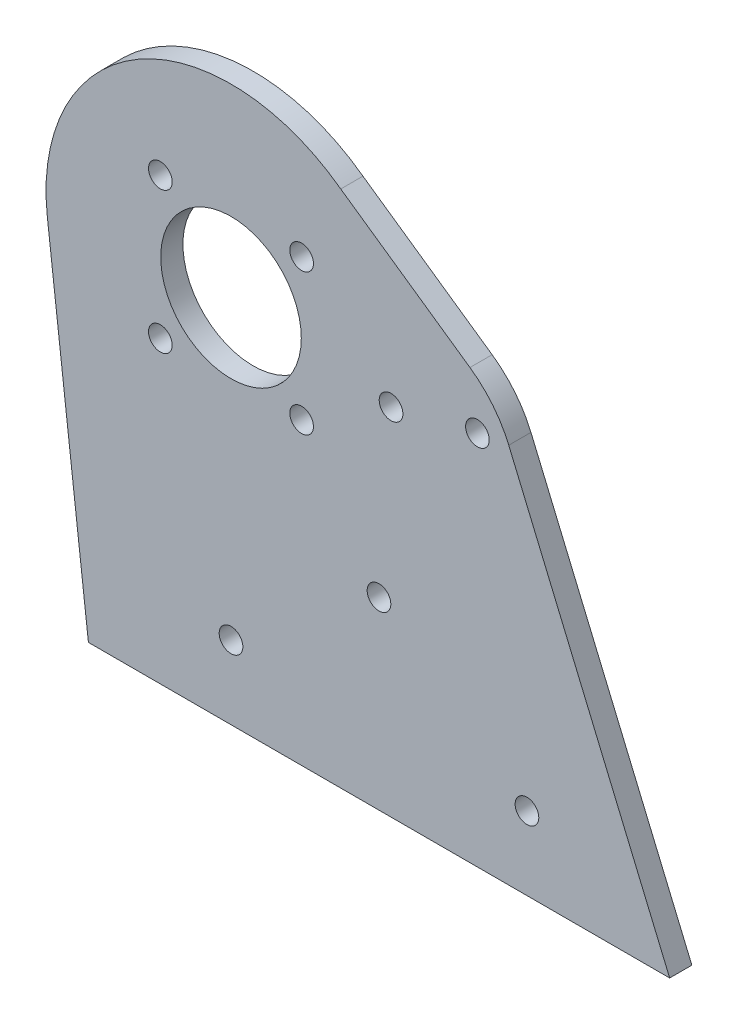
ISO-10303-21;
HEADER;
FILE_DESCRIPTION(('STEP AP214'),'2;1');
FILE_NAME('part.step','',(''),(''),'','','');
FILE_SCHEMA(('AUTOMOTIVE_DESIGN { 1 0 10303 214 1 1 1 1 }'));
ENDSEC;
DATA;
#1=APPLICATION_CONTEXT('core data for automotive mechanical design processes');
#2=APPLICATION_PROTOCOL_DEFINITION('international standard','automotive_design',2000,#1);
#3=PRODUCT_CONTEXT('',#1,'mechanical');
#4=PRODUCT('Part','Part','',(#3));
#5=PRODUCT_RELATED_PRODUCT_CATEGORY('part','',(#4));
#6=PRODUCT_DEFINITION_FORMATION('','',#4);
#7=PRODUCT_DEFINITION_CONTEXT('part definition',#1,'design');
#8=PRODUCT_DEFINITION('design','',#6,#7);
#9=PRODUCT_DEFINITION_SHAPE('','',#8);
#10=(LENGTH_UNIT() NAMED_UNIT(*) SI_UNIT(.MILLI.,.METRE.));
#11=(NAMED_UNIT(*) PLANE_ANGLE_UNIT() SI_UNIT($,.RADIAN.));
#12=(NAMED_UNIT(*) SI_UNIT($,.STERADIAN.) SOLID_ANGLE_UNIT());
#13=UNCERTAINTY_MEASURE_WITH_UNIT(LENGTH_MEASURE(1.E-05),#10,'distance_accuracy_value','');
#14=(GEOMETRIC_REPRESENTATION_CONTEXT(3) GLOBAL_UNCERTAINTY_ASSIGNED_CONTEXT((#13)) GLOBAL_UNIT_ASSIGNED_CONTEXT((#10,
#11,#12)) REPRESENTATION_CONTEXT('',''));
#15=CARTESIAN_POINT('',(0.,0.,0.));
#16=DIRECTION('',(0.,0.,1.));
#17=DIRECTION('',(1.,0.,0.));
#18=AXIS2_PLACEMENT_3D('',#15,#16,#17);
#19=CARTESIAN_POINT('',(28.2496560925512,11.9322590620429,3.));
#20=DIRECTION('',(0.921195491285499,0.389100073034263,0.));
#21=DIRECTION('',(-0.389100073034263,0.921195491285499,0.));
#22=AXIS2_PLACEMENT_3D('',#19,#20,#21);
#23=PLANE('',#22);
#24=DIRECTION('',(0.389100073034263,-0.921195491285499,0.));
#25=VECTOR('',#24,1.);
#26=CARTESIAN_POINT('',(28.2496560925512,11.9322590620429,0.));
#27=LINE('',#26,#25);
#28=CARTESIAN_POINT('',(27.9968136972938,12.5308641270602,0.));
#29=VERTEX_POINT('',#28);
#30=CARTESIAN_POINT('',(49.7449466353483,-38.9579003190192,0.));
#31=VERTEX_POINT('',#30);
#32=EDGE_CURVE('E133',#29,#31,#27,.T.);
#33=ORIENTED_EDGE('',*,*,#32,.F.);
#34=DIRECTION('',(0.,0.,-1.));
#35=VECTOR('',#34,1.);
#36=CARTESIAN_POINT('',(27.9968136972938,12.5308641270602,3.));
#37=LINE('',#36,#35);
#38=CARTESIAN_POINT('',(27.9968136972938,12.5308641270602,3.));
#39=VERTEX_POINT('',#38);
#40=EDGE_CURVE('E11',#39,#29,#37,.T.);
#41=ORIENTED_EDGE('',*,*,#40,.F.);
#42=DIRECTION('',(0.389100073034263,-0.921195491285499,0.));
#43=VECTOR('',#42,1.);
#44=CARTESIAN_POINT('',(28.2496560925512,11.9322590620429,3.));
#45=LINE('',#44,#43);
#46=CARTESIAN_POINT('',(49.7449466353483,-38.9579003190192,3.));
#47=VERTEX_POINT('',#46);
#48=EDGE_CURVE('E247',#39,#47,#45,.T.);
#49=ORIENTED_EDGE('',*,*,#48,.T.);
#50=DIRECTION('',(0.,0.,-1.));
#51=VECTOR('',#50,1.);
#52=CARTESIAN_POINT('',(49.7449466353483,-38.9579003190192,3.));
#53=LINE('',#52,#51);
#54=EDGE_CURVE('E82',#47,#31,#53,.T.);
#55=ORIENTED_EDGE('',*,*,#54,.T.);
#56=EDGE_LOOP('',(#33,#41,#49,#55));
#57=FACE_BOUND('',#56,.T.);
#58=ADVANCED_FACE('F36',(#57),#23,.T.);
#59=CARTESIAN_POINT('',(14.1788813280114,6.69436303154627,3.));
#60=DIRECTION('',(0.,0.,-1.));
#61=DIRECTION('',(-1.,0.,0.));
#62=AXIS2_PLACEMENT_3D('',#59,#60,#61);
#63=CYLINDRICAL_SURFACE('',#62,14.9999999999999);
#64=CARTESIAN_POINT('',(14.1788813280114,6.69436303154627,0.));
#65=DIRECTION('',(0.,0.,1.));
#66=DIRECTION('',(1.,0.,0.));
#67=AXIS2_PLACEMENT_3D('',#64,#65,#66);
#68=CIRCLE('',#67,14.9999999999999);
#69=CARTESIAN_POINT('',(22.7526786089361,19.0024904352419,0.));
#70=VERTEX_POINT('',#69);
#71=EDGE_CURVE('E131',#29,#70,#68,.T.);
#72=ORIENTED_EDGE('',*,*,#71,.T.);
#73=DIRECTION('',(0.,0.,-1.));
#74=VECTOR('',#73,1.);
#75=CARTESIAN_POINT('',(22.7526786089361,19.0024904352419,3.));
#76=LINE('',#75,#74);
#77=CARTESIAN_POINT('',(22.7526786089361,19.0024904352419,3.));
#78=VERTEX_POINT('',#77);
#79=EDGE_CURVE('E46',#78,#70,#76,.T.);
#80=ORIENTED_EDGE('',*,*,#79,.F.);
#81=CARTESIAN_POINT('',(14.1788813280114,6.69436303154627,3.));
#82=DIRECTION('',(0.,0.,1.));
#83=DIRECTION('',(1.,0.,0.));
#84=AXIS2_PLACEMENT_3D('',#81,#82,#83);
#85=CIRCLE('',#84,14.9999999999999);
#86=EDGE_CURVE('E249',#39,#78,#85,.T.);
#87=ORIENTED_EDGE('',*,*,#86,.F.);
#88=ORIENTED_EDGE('',*,*,#40,.T.);
#89=EDGE_LOOP('',(#72,#80,#87,#88));
#90=FACE_BOUND('',#89,.T.);
#91=ADVANCED_FACE('F132',(#90),#63,.T.);
#92=CARTESIAN_POINT('',(16.3459226912162,23.4654135644258,3.));
#93=DIRECTION('',(-0.571586485394987,-0.820541826913051,0.));
#94=DIRECTION('',(0.820541826913051,-0.571586485394987,0.));
#95=AXIS2_PLACEMENT_3D('',#92,#93,#94);
#96=PLANE('',#95);
#97=DIRECTION('',(-0.820541826913051,0.571586485394987,0.));
#98=VECTOR('',#97,1.);
#99=CARTESIAN_POINT('',(16.3459226912162,23.4654135644258,0.));
#100=LINE('',#99,#98);
#101=CARTESIAN_POINT('',(5.29002578608377,31.1669115839333,0.));
#102=VERTEX_POINT('',#101);
#103=EDGE_CURVE('E128',#70,#102,#100,.T.);
#104=ORIENTED_EDGE('',*,*,#103,.T.);
#105=DIRECTION('',(0.,0.,-1.));
#106=VECTOR('',#105,1.);
#107=CARTESIAN_POINT('',(5.29002578608377,31.1669115839333,3.));
#108=LINE('',#107,#106);
#109=CARTESIAN_POINT('',(5.29002578608377,31.1669115839333,3.));
#110=VERTEX_POINT('',#109);
#111=EDGE_CURVE('E116',#110,#102,#108,.T.);
#112=ORIENTED_EDGE('',*,*,#111,.F.);
#113=DIRECTION('',(-0.820541826913051,0.571586485394987,0.));
#114=VECTOR('',#113,1.);
#115=CARTESIAN_POINT('',(16.3459226912162,23.4654135644258,3.));
#116=LINE('',#115,#114);
#117=EDGE_CURVE('E109',#78,#110,#116,.T.);
#118=ORIENTED_EDGE('',*,*,#117,.F.);
#119=ORIENTED_EDGE('',*,*,#79,.T.);
#120=EDGE_LOOP('',(#104,#112,#118,#119));
#121=FACE_BOUND('',#120,.T.);
#122=ADVANCED_FACE('F127',(#121),#96,.F.);
#123=CARTESIAN_POINT('',(-9.54209968097275,11.0420996809744,3.));
#124=DIRECTION('',(0.,0.,-1.));
#125=DIRECTION('',(-1.,0.,0.));
#126=AXIS2_PLACEMENT_3D('',#123,#124,#125);
#127=CYLINDRICAL_SURFACE('',#126,24.9999999999997);
#128=CARTESIAN_POINT('',(-9.54209968097275,11.0420996809744,0.));
#129=DIRECTION('',(0.,0.,1.));
#130=DIRECTION('',(1.,0.,0.));
#131=AXIS2_PLACEMENT_3D('',#128,#129,#130);
#132=CIRCLE('',#131,24.9999999999997);
#133=CARTESIAN_POINT('',(-34.3697379965047,8.11150662271487,0.));
#134=VERTEX_POINT('',#133);
#135=EDGE_CURVE('E115',#102,#134,#132,.T.);
#136=ORIENTED_EDGE('',*,*,#135,.T.);
#137=DIRECTION('',(0.,0.,-1.));
#138=VECTOR('',#137,1.);
#139=CARTESIAN_POINT('',(-34.3697379965047,8.11150662271487,3.));
#140=LINE('',#139,#138);
#141=CARTESIAN_POINT('',(-34.3697379965047,8.11150662271487,3.));
#142=VERTEX_POINT('',#141);
#143=EDGE_CURVE('E101',#142,#134,#140,.T.);
#144=ORIENTED_EDGE('',*,*,#143,.F.);
#145=CARTESIAN_POINT('',(-9.54209968097275,11.0420996809744,3.));
#146=DIRECTION('',(0.,0.,1.));
#147=DIRECTION('',(1.,0.,0.));
#148=AXIS2_PLACEMENT_3D('',#145,#146,#147);
#149=CIRCLE('',#148,24.9999999999997);
#150=EDGE_CURVE('E104',#110,#142,#149,.T.);
#151=ORIENTED_EDGE('',*,*,#150,.F.);
#152=ORIENTED_EDGE('',*,*,#111,.T.);
#153=EDGE_LOOP('',(#136,#144,#151,#152));
#154=FACE_BOUND('',#153,.T.);
#155=ADVANCED_FACE('F114',(#154),#127,.T.);
#156=CARTESIAN_POINT('',(-32.9531443219081,-3.88970770277316,3.));
#157=DIRECTION('',(0.993105532621289,0.117223722330361,0.));
#158=DIRECTION('',(-0.117223722330361,0.993105532621289,0.));
#159=AXIS2_PLACEMENT_3D('',#156,#157,#158);
#160=PLANE('',#159);
#161=DIRECTION('',(0.117223722330361,-0.993105532621289,0.));
#162=VECTOR('',#161,1.);
#163=CARTESIAN_POINT('',(-32.9531443219081,-3.88970770277316,0.));
#164=LINE('',#163,#162);
#165=CARTESIAN_POINT('',(-28.8137815464093,-38.9579003190193,0.));
#166=VERTEX_POINT('',#165);
#167=EDGE_CURVE('E141',#134,#166,#164,.T.);
#168=ORIENTED_EDGE('',*,*,#167,.T.);
#169=DIRECTION('',(0.,0.,-1.));
#170=VECTOR('',#169,1.);
#171=CARTESIAN_POINT('',(-28.8137815464093,-38.9579003190193,3.));
#172=LINE('',#171,#170);
#173=CARTESIAN_POINT('',(-28.8137815464093,-38.9579003190193,3.));
#174=VERTEX_POINT('',#173);
#175=EDGE_CURVE('E103',#174,#166,#172,.T.);
#176=ORIENTED_EDGE('',*,*,#175,.F.);
#177=DIRECTION('',(0.117223722330361,-0.993105532621289,0.));
#178=VECTOR('',#177,1.);
#179=CARTESIAN_POINT('',(-32.9531443219081,-3.88970770277316,3.));
#180=LINE('',#179,#178);
#181=EDGE_CURVE('E96',#142,#174,#180,.T.);
#182=ORIENTED_EDGE('',*,*,#181,.F.);
#183=ORIENTED_EDGE('',*,*,#143,.T.);
#184=EDGE_LOOP('',(#168,#176,#182,#183));
#185=FACE_BOUND('',#184,.T.);
#186=ADVANCED_FACE('F99',(#185),#160,.F.);
#187=CARTESIAN_POINT('',(12.0886473321988,9.04420695310826,3.));
#188=DIRECTION('',(0.,0.,-1.));
#189=DIRECTION('',(-1.,0.,0.));
#190=AXIS2_PLACEMENT_3D('',#187,#188,#189);
#191=CYLINDRICAL_SURFACE('',#190,1.6);
#192=CARTESIAN_POINT('',(12.0886473321988,9.04420695310826,3.));
#193=DIRECTION('',(0.,0.,1.));
#194=DIRECTION('',(1.,0.,0.));
#195=AXIS2_PLACEMENT_3D('',#192,#193,#194);
#196=CIRCLE('',#195,1.6);
#197=CARTESIAN_POINT('',(13.6886473321988,9.04420695310826,3.));
#198=VERTEX_POINT('',#197);
#199=EDGE_CURVE('E245',#198,#198,#196,.T.);
#200=ORIENTED_EDGE('',*,*,#199,.T.);
#201=EDGE_LOOP('',(#200));
#202=FACE_BOUND('',#201,.T.);
#203=CARTESIAN_POINT('',(12.0886473321988,9.04420695310826,0.));
#204=DIRECTION('',(0.,0.,1.));
#205=DIRECTION('',(1.,0.,0.));
#206=AXIS2_PLACEMENT_3D('',#203,#204,#205);
#207=CIRCLE('',#206,1.6);
#208=CARTESIAN_POINT('',(13.6886473321988,9.04420695310826,0.));
#209=VERTEX_POINT('',#208);
#210=EDGE_CURVE('E136',#209,#209,#207,.T.);
#211=ORIENTED_EDGE('',*,*,#210,.F.);
#212=EDGE_LOOP('',(#211));
#213=FACE_BOUND('',#212,.T.);
#214=ADVANCED_FACE('F174',(#202,#213),#191,.F.);
#215=CARTESIAN_POINT('',(23.7627988751439,11.8216492571612,3.));
#216=DIRECTION('',(0.,0.,-1.));
#217=DIRECTION('',(-1.,0.,0.));
#218=AXIS2_PLACEMENT_3D('',#215,#216,#217);
#219=CYLINDRICAL_SURFACE('',#218,1.6);
#220=CARTESIAN_POINT('',(23.7627988751439,11.8216492571612,3.));
#221=DIRECTION('',(0.,0.,1.));
#222=DIRECTION('',(1.,0.,0.));
#223=AXIS2_PLACEMENT_3D('',#220,#221,#222);
#224=CIRCLE('',#223,1.6);
#225=CARTESIAN_POINT('',(25.3627988751439,11.8216492571612,3.));
#226=VERTEX_POINT('',#225);
#227=EDGE_CURVE('E242',#226,#226,#224,.T.);
#228=ORIENTED_EDGE('',*,*,#227,.T.);
#229=EDGE_LOOP('',(#228));
#230=FACE_BOUND('',#229,.T.);
#231=CARTESIAN_POINT('',(23.7627988751439,11.8216492571612,0.));
#232=DIRECTION('',(0.,0.,1.));
#233=DIRECTION('',(1.,0.,0.));
#234=AXIS2_PLACEMENT_3D('',#231,#232,#233);
#235=CIRCLE('',#234,1.6);
#236=CARTESIAN_POINT('',(25.3627988751439,11.8216492571612,0.));
#237=VERTEX_POINT('',#236);
#238=EDGE_CURVE('E167',#237,#237,#235,.T.);
#239=ORIENTED_EDGE('',*,*,#238,.F.);
#240=EDGE_LOOP('',(#239));
#241=FACE_BOUND('',#240,.T.);
#242=ADVANCED_FACE('F176',(#230,#241),#219,.F.);
#243=CARTESIAN_POINT('',(-9.54209968097275,-29.042678354541,3.));
#244=DIRECTION('',(0.,0.,-1.));
#245=DIRECTION('',(-1.,0.,0.));
#246=AXIS2_PLACEMENT_3D('',#243,#244,#245);
#247=CYLINDRICAL_SURFACE('',#246,1.6);
#248=CARTESIAN_POINT('',(-9.54209968097275,-29.042678354541,3.));
#249=DIRECTION('',(0.,0.,1.));
#250=DIRECTION('',(1.,0.,0.));
#251=AXIS2_PLACEMENT_3D('',#248,#249,#250);
#252=CIRCLE('',#251,1.6);
#253=CARTESIAN_POINT('',(-7.94209968097275,-29.042678354541,3.));
#254=VERTEX_POINT('',#253);
#255=EDGE_CURVE('E239',#254,#254,#252,.T.);
#256=ORIENTED_EDGE('',*,*,#255,.T.);
#257=EDGE_LOOP('',(#256));
#258=FACE_BOUND('',#257,.T.);
#259=CARTESIAN_POINT('',(-9.54209968097275,-29.042678354541,0.));
#260=DIRECTION('',(0.,0.,1.));
#261=DIRECTION('',(1.,0.,0.));
#262=AXIS2_PLACEMENT_3D('',#259,#260,#261);
#263=CIRCLE('',#262,1.6);
#264=CARTESIAN_POINT('',(-7.94209968097275,-29.042678354541,0.));
#265=VERTEX_POINT('',#264);
#266=EDGE_CURVE('E164',#265,#265,#263,.T.);
#267=ORIENTED_EDGE('',*,*,#266,.F.);
#268=EDGE_LOOP('',(#267));
#269=FACE_BOUND('',#268,.T.);
#270=ADVANCED_FACE('F183',(#258,#269),#247,.F.);
#271=CARTESIAN_POINT('',(30.4579003190273,-29.0426783545428,3.));
#272=DIRECTION('',(0.,0.,-1.));
#273=DIRECTION('',(-1.,0.,0.));
#274=AXIS2_PLACEMENT_3D('',#271,#272,#273);
#275=CYLINDRICAL_SURFACE('',#274,1.6);
#276=CARTESIAN_POINT('',(30.4579003190273,-29.0426783545428,3.));
#277=DIRECTION('',(0.,0.,1.));
#278=DIRECTION('',(1.,0.,0.));
#279=AXIS2_PLACEMENT_3D('',#276,#277,#278);
#280=CIRCLE('',#279,1.6);
#281=CARTESIAN_POINT('',(32.0579003190273,-29.0426783545428,3.));
#282=VERTEX_POINT('',#281);
#283=EDGE_CURVE('E236',#282,#282,#280,.T.);
#284=ORIENTED_EDGE('',*,*,#283,.T.);
#285=EDGE_LOOP('',(#284));
#286=FACE_BOUND('',#285,.T.);
#287=CARTESIAN_POINT('',(30.4579003190273,-29.0426783545428,0.));
#288=DIRECTION('',(0.,0.,1.));
#289=DIRECTION('',(1.,0.,0.));
#290=AXIS2_PLACEMENT_3D('',#287,#288,#289);
#291=CIRCLE('',#290,1.6);
#292=CARTESIAN_POINT('',(32.0579003190273,-29.0426783545428,0.));
#293=VERTEX_POINT('',#292);
#294=EDGE_CURVE('E161',#293,#293,#291,.T.);
#295=ORIENTED_EDGE('',*,*,#294,.F.);
#296=EDGE_LOOP('',(#295));
#297=FACE_BOUND('',#296,.T.);
#298=ADVANCED_FACE('F263',(#286,#297),#275,.F.);
#299=CARTESIAN_POINT('',(10.4579003190273,-14.0426783545404,3.));
#300=DIRECTION('',(0.,0.,-1.));
#301=DIRECTION('',(-1.,0.,0.));
#302=AXIS2_PLACEMENT_3D('',#299,#300,#301);
#303=CYLINDRICAL_SURFACE('',#302,1.6);
#304=CARTESIAN_POINT('',(10.4579003190273,-14.0426783545404,3.));
#305=DIRECTION('',(0.,0.,1.));
#306=DIRECTION('',(1.,0.,0.));
#307=AXIS2_PLACEMENT_3D('',#304,#305,#306);
#308=CIRCLE('',#307,1.6);
#309=CARTESIAN_POINT('',(12.0579003190273,-14.0426783545404,3.));
#310=VERTEX_POINT('',#309);
#311=EDGE_CURVE('E233',#310,#310,#308,.T.);
#312=ORIENTED_EDGE('',*,*,#311,.T.);
#313=EDGE_LOOP('',(#312));
#314=FACE_BOUND('',#313,.T.);
#315=CARTESIAN_POINT('',(10.4579003190273,-14.0426783545404,0.));
#316=DIRECTION('',(0.,0.,1.));
#317=DIRECTION('',(1.,0.,0.));
#318=AXIS2_PLACEMENT_3D('',#315,#316,#317);
#319=CIRCLE('',#318,1.6);
#320=CARTESIAN_POINT('',(12.0579003190273,-14.0426783545404,0.));
#321=VERTEX_POINT('',#320);
#322=EDGE_CURVE('E158',#321,#321,#319,.T.);
#323=ORIENTED_EDGE('',*,*,#322,.F.);
#324=EDGE_LOOP('',(#323));
#325=FACE_BOUND('',#324,.T.);
#326=ADVANCED_FACE('F270',(#314,#325),#303,.F.);
#327=CARTESIAN_POINT('',(0.000307158788181994,20.5838919459733,3.));
#328=DIRECTION('',(0.,0.,-1.));
#329=DIRECTION('',(-1.,0.,0.));
#330=AXIS2_PLACEMENT_3D('',#327,#328,#329);
#331=CYLINDRICAL_SURFACE('',#330,1.6);
#332=CARTESIAN_POINT('',(0.000307158788181994,20.5838919459733,3.));
#333=DIRECTION('',(0.,0.,1.));
#334=DIRECTION('',(1.,0.,0.));
#335=AXIS2_PLACEMENT_3D('',#332,#333,#334);
#336=CIRCLE('',#335,1.6);
#337=CARTESIAN_POINT('',(1.60030715878818,20.5838919459733,3.));
#338=VERTEX_POINT('',#337);
#339=EDGE_CURVE('E230',#338,#338,#336,.T.);
#340=ORIENTED_EDGE('',*,*,#339,.T.);
#341=EDGE_LOOP('',(#340));
#342=FACE_BOUND('',#341,.T.);
#343=CARTESIAN_POINT('',(0.000307158788181994,20.5838919459733,0.));
#344=DIRECTION('',(0.,0.,1.));
#345=DIRECTION('',(1.,0.,0.));
#346=AXIS2_PLACEMENT_3D('',#343,#344,#345);
#347=CIRCLE('',#346,1.6);
#348=CARTESIAN_POINT('',(1.60030715878818,20.5838919459733,0.));
#349=VERTEX_POINT('',#348);
#350=EDGE_CURVE('E155',#349,#349,#347,.T.);
#351=ORIENTED_EDGE('',*,*,#350,.F.);
#352=EDGE_LOOP('',(#351));
#353=FACE_BOUND('',#352,.T.);
#354=ADVANCED_FACE('F276',(#342,#353),#331,.F.);
#355=CARTESIAN_POINT('',(0.,1.50000000000006,3.));
#356=DIRECTION('',(0.,0.,-1.));
#357=DIRECTION('',(-1.,0.,0.));
#358=AXIS2_PLACEMENT_3D('',#355,#356,#357);
#359=CYLINDRICAL_SURFACE('',#358,1.6);
#360=CARTESIAN_POINT('',(0.,1.50000000000006,3.));
#361=DIRECTION('',(0.,0.,1.));
#362=DIRECTION('',(1.,0.,0.));
#363=AXIS2_PLACEMENT_3D('',#360,#361,#362);
#364=CIRCLE('',#363,1.6);
#365=CARTESIAN_POINT('',(1.6,1.50000000000006,3.));
#366=VERTEX_POINT('',#365);
#367=EDGE_CURVE('E227',#366,#366,#364,.T.);
#368=ORIENTED_EDGE('',*,*,#367,.T.);
#369=EDGE_LOOP('',(#368));
#370=FACE_BOUND('',#369,.T.);
#371=CARTESIAN_POINT('',(0.,1.50000000000006,0.));
#372=DIRECTION('',(0.,0.,1.));
#373=DIRECTION('',(1.,0.,0.));
#374=AXIS2_PLACEMENT_3D('',#371,#372,#373);
#375=CIRCLE('',#374,1.6);
#376=CARTESIAN_POINT('',(1.6,1.50000000000006,0.));
#377=VERTEX_POINT('',#376);
#378=EDGE_CURVE('E152',#377,#377,#375,.T.);
#379=ORIENTED_EDGE('',*,*,#378,.F.);
#380=EDGE_LOOP('',(#379));
#381=FACE_BOUND('',#380,.T.);
#382=ADVANCED_FACE('F280',(#370,#381),#359,.F.);
#383=CARTESIAN_POINT('',(-19.0915741304867,1.49201065669935,3.));
#384=DIRECTION('',(0.,0.,-1.));
#385=DIRECTION('',(-1.,0.,0.));
#386=AXIS2_PLACEMENT_3D('',#383,#384,#385);
#387=CYLINDRICAL_SURFACE('',#386,1.6);
#388=CARTESIAN_POINT('',(-19.0915741304867,1.49201065669935,3.));
#389=DIRECTION('',(0.,0.,1.));
#390=DIRECTION('',(1.,0.,0.));
#391=AXIS2_PLACEMENT_3D('',#388,#389,#390);
#392=CIRCLE('',#391,1.6);
#393=CARTESIAN_POINT('',(-17.4915741304867,1.49201065669935,3.));
#394=VERTEX_POINT('',#393);
#395=EDGE_CURVE('E224',#394,#394,#392,.T.);
#396=ORIENTED_EDGE('',*,*,#395,.T.);
#397=EDGE_LOOP('',(#396));
#398=FACE_BOUND('',#397,.T.);
#399=CARTESIAN_POINT('',(-19.0915741304867,1.49201065669935,0.));
#400=DIRECTION('',(0.,0.,1.));
#401=DIRECTION('',(1.,0.,0.));
#402=AXIS2_PLACEMENT_3D('',#399,#400,#401);
#403=CIRCLE('',#402,1.6);
#404=CARTESIAN_POINT('',(-17.4915741304867,1.49201065669935,0.));
#405=VERTEX_POINT('',#404);
#406=EDGE_CURVE('E149',#405,#405,#403,.T.);
#407=ORIENTED_EDGE('',*,*,#406,.F.);
#408=EDGE_LOOP('',(#407));
#409=FACE_BOUND('',#408,.T.);
#410=ADVANCED_FACE('F283',(#398,#409),#387,.F.);
#411=CARTESIAN_POINT('',(-19.0918815464594,20.5918815464621,3.));
#412=DIRECTION('',(0.,0.,-1.));
#413=DIRECTION('',(-1.,0.,0.));
#414=AXIS2_PLACEMENT_3D('',#411,#412,#413);
#415=CYLINDRICAL_SURFACE('',#414,1.6);
#416=CARTESIAN_POINT('',(-19.0918815464594,20.5918815464621,3.));
#417=DIRECTION('',(0.,0.,1.));
#418=DIRECTION('',(1.,0.,0.));
#419=AXIS2_PLACEMENT_3D('',#416,#417,#418);
#420=CIRCLE('',#419,1.6);
#421=CARTESIAN_POINT('',(-17.4918815464594,20.5918815464621,3.));
#422=VERTEX_POINT('',#421);
#423=EDGE_CURVE('E143',#422,#422,#420,.T.);
#424=ORIENTED_EDGE('',*,*,#423,.T.);
#425=EDGE_LOOP('',(#424));
#426=FACE_BOUND('',#425,.T.);
#427=CARTESIAN_POINT('',(-19.0918815464594,20.5918815464621,0.));
#428=DIRECTION('',(0.,0.,1.));
#429=DIRECTION('',(1.,0.,0.));
#430=AXIS2_PLACEMENT_3D('',#427,#428,#429);
#431=CIRCLE('',#430,1.6);
#432=CARTESIAN_POINT('',(-17.4918815464594,20.5918815464621,0.));
#433=VERTEX_POINT('',#432);
#434=EDGE_CURVE('E146',#433,#433,#431,.T.);
#435=ORIENTED_EDGE('',*,*,#434,.F.);
#436=EDGE_LOOP('',(#435));
#437=FACE_BOUND('',#436,.T.);
#438=ADVANCED_FACE('F38',(#426,#437),#415,.F.);
#439=CARTESIAN_POINT('',(0.,-38.9579003190192,3.));
#440=DIRECTION('',(0.,1.,0.));
#441=DIRECTION('',(0.,0.,1.));
#442=AXIS2_PLACEMENT_3D('',#439,#440,#441);
#443=PLANE('',#442);
#444=DIRECTION('',(1.,0.,0.));
#445=VECTOR('',#444,1.);
#446=CARTESIAN_POINT('',(0.,-38.9579003190192,0.));
#447=LINE('',#446,#445);
#448=EDGE_CURVE('E75',#166,#31,#447,.T.);
#449=ORIENTED_EDGE('',*,*,#448,.T.);
#450=ORIENTED_EDGE('',*,*,#54,.F.);
#451=DIRECTION('',(1.,0.,0.));
#452=VECTOR('',#451,1.);
#453=CARTESIAN_POINT('',(0.,-38.9579003190192,3.));
#454=LINE('',#453,#452);
#455=EDGE_CURVE('E54',#174,#47,#454,.T.);
#456=ORIENTED_EDGE('',*,*,#455,.F.);
#457=ORIENTED_EDGE('',*,*,#175,.T.);
#458=EDGE_LOOP('',(#449,#450,#456,#457));
#459=FACE_BOUND('',#458,.T.);
#460=ADVANCED_FACE('F199',(#459),#443,.F.);
#461=CARTESIAN_POINT('',(0.,0.,3.));
#462=DIRECTION('',(0.,0.,1.));
#463=DIRECTION('',(1.,0.,0.));
#464=AXIS2_PLACEMENT_3D('',#461,#462,#463);
#465=PLANE('',#464);
#466=CARTESIAN_POINT('',(-9.54209968097275,11.0420996809744,3.));
#467=DIRECTION('',(0.,0.,1.));
#468=DIRECTION('',(1.,0.,0.));
#469=AXIS2_PLACEMENT_3D('',#466,#467,#468);
#470=CIRCLE('',#469,9.5);
#471=CARTESIAN_POINT('',(-0.042099680972749,11.0420996809744,3.));
#472=VERTEX_POINT('',#471);
#473=EDGE_CURVE('E217',#472,#472,#470,.T.);
#474=ORIENTED_EDGE('',*,*,#473,.F.);
#475=EDGE_LOOP('',(#474));
#476=FACE_BOUND('',#475,.T.);
#477=ORIENTED_EDGE('',*,*,#423,.F.);
#478=EDGE_LOOP('',(#477));
#479=FACE_BOUND('',#478,.T.);
#480=ORIENTED_EDGE('',*,*,#395,.F.);
#481=EDGE_LOOP('',(#480));
#482=FACE_BOUND('',#481,.T.);
#483=ORIENTED_EDGE('',*,*,#367,.F.);
#484=EDGE_LOOP('',(#483));
#485=FACE_BOUND('',#484,.T.);
#486=ORIENTED_EDGE('',*,*,#339,.F.);
#487=EDGE_LOOP('',(#486));
#488=FACE_BOUND('',#487,.T.);
#489=ORIENTED_EDGE('',*,*,#311,.F.);
#490=EDGE_LOOP('',(#489));
#491=FACE_BOUND('',#490,.T.);
#492=ORIENTED_EDGE('',*,*,#283,.F.);
#493=EDGE_LOOP('',(#492));
#494=FACE_BOUND('',#493,.T.);
#495=ORIENTED_EDGE('',*,*,#255,.F.);
#496=EDGE_LOOP('',(#495));
#497=FACE_BOUND('',#496,.T.);
#498=ORIENTED_EDGE('',*,*,#227,.F.);
#499=EDGE_LOOP('',(#498));
#500=FACE_BOUND('',#499,.T.);
#501=ORIENTED_EDGE('',*,*,#199,.F.);
#502=EDGE_LOOP('',(#501));
#503=FACE_BOUND('',#502,.T.);
#504=ORIENTED_EDGE('',*,*,#48,.F.);
#505=ORIENTED_EDGE('',*,*,#86,.T.);
#506=ORIENTED_EDGE('',*,*,#117,.T.);
#507=ORIENTED_EDGE('',*,*,#150,.T.);
#508=ORIENTED_EDGE('',*,*,#181,.T.);
#509=ORIENTED_EDGE('',*,*,#455,.T.);
#510=EDGE_LOOP('',(#504,#505,#506,#507,#508,#509));
#511=FACE_BOUND('',#510,.T.);
#512=ADVANCED_FACE('F107',(#476,#479,#482,#485,#488,#491,#494,#497,#500,#503,#511),#465,.T.);
#513=CARTESIAN_POINT('',(0.,0.,0.));
#514=DIRECTION('',(0.,0.,1.));
#515=DIRECTION('',(1.,0.,0.));
#516=AXIS2_PLACEMENT_3D('',#513,#514,#515);
#517=PLANE('',#516);
#518=CARTESIAN_POINT('',(-9.54209968097275,11.0420996809744,0.));
#519=DIRECTION('',(0.,0.,1.));
#520=DIRECTION('',(1.,0.,0.));
#521=AXIS2_PLACEMENT_3D('',#518,#519,#520);
#522=CIRCLE('',#521,9.5);
#523=CARTESIAN_POINT('',(-0.042099680972749,11.0420996809744,0.));
#524=VERTEX_POINT('',#523);
#525=EDGE_CURVE('E40',#524,#524,#522,.T.);
#526=ORIENTED_EDGE('',*,*,#525,.T.);
#527=EDGE_LOOP('',(#526));
#528=FACE_BOUND('',#527,.T.);
#529=ORIENTED_EDGE('',*,*,#434,.T.);
#530=EDGE_LOOP('',(#529));
#531=FACE_BOUND('',#530,.T.);
#532=ORIENTED_EDGE('',*,*,#406,.T.);
#533=EDGE_LOOP('',(#532));
#534=FACE_BOUND('',#533,.T.);
#535=ORIENTED_EDGE('',*,*,#378,.T.);
#536=EDGE_LOOP('',(#535));
#537=FACE_BOUND('',#536,.T.);
#538=ORIENTED_EDGE('',*,*,#350,.T.);
#539=EDGE_LOOP('',(#538));
#540=FACE_BOUND('',#539,.T.);
#541=ORIENTED_EDGE('',*,*,#322,.T.);
#542=EDGE_LOOP('',(#541));
#543=FACE_BOUND('',#542,.T.);
#544=ORIENTED_EDGE('',*,*,#294,.T.);
#545=EDGE_LOOP('',(#544));
#546=FACE_BOUND('',#545,.T.);
#547=ORIENTED_EDGE('',*,*,#266,.T.);
#548=EDGE_LOOP('',(#547));
#549=FACE_BOUND('',#548,.T.);
#550=ORIENTED_EDGE('',*,*,#238,.T.);
#551=EDGE_LOOP('',(#550));
#552=FACE_BOUND('',#551,.T.);
#553=ORIENTED_EDGE('',*,*,#210,.T.);
#554=EDGE_LOOP('',(#553));
#555=FACE_BOUND('',#554,.T.);
#556=ORIENTED_EDGE('',*,*,#32,.T.);
#557=ORIENTED_EDGE('',*,*,#448,.F.);
#558=ORIENTED_EDGE('',*,*,#167,.F.);
#559=ORIENTED_EDGE('',*,*,#135,.F.);
#560=ORIENTED_EDGE('',*,*,#103,.F.);
#561=ORIENTED_EDGE('',*,*,#71,.F.);
#562=EDGE_LOOP('',(#556,#557,#558,#559,#560,#561));
#563=FACE_BOUND('',#562,.T.);
#564=ADVANCED_FACE('F172',(#528,#531,#534,#537,#540,#543,#546,#549,#552,#555,#563),#517,.F.);
#565=CARTESIAN_POINT('',(-9.54209968097275,11.0420996809744,-7.));
#566=DIRECTION('',(0.,0.,1.));
#567=DIRECTION('',(1.,0.,0.));
#568=AXIS2_PLACEMENT_3D('',#565,#566,#567);
#569=CYLINDRICAL_SURFACE('',#568,9.5);
#570=ORIENTED_EDGE('',*,*,#473,.T.);
#571=EDGE_LOOP('',(#570));
#572=FACE_BOUND('',#571,.T.);
#573=ORIENTED_EDGE('',*,*,#525,.F.);
#574=EDGE_LOOP('',(#573));
#575=FACE_BOUND('',#574,.T.);
#576=ADVANCED_FACE('F205',(#572,#575),#569,.F.);
#577=CLOSED_SHELL('',(#58,#91,#122,#155,#186,#214,#242,#270,#298,#326,#354,#382,#410,#438,#460,
#512,#564,#576));
#578=MANIFOLD_SOLID_BREP('B2',#577);
#579=ADVANCED_BREP_SHAPE_REPRESENTATION('',(#18,#578),#14);
#580=SHAPE_DEFINITION_REPRESENTATION(#9,#579);
ENDSEC;
END-ISO-10303-21;
